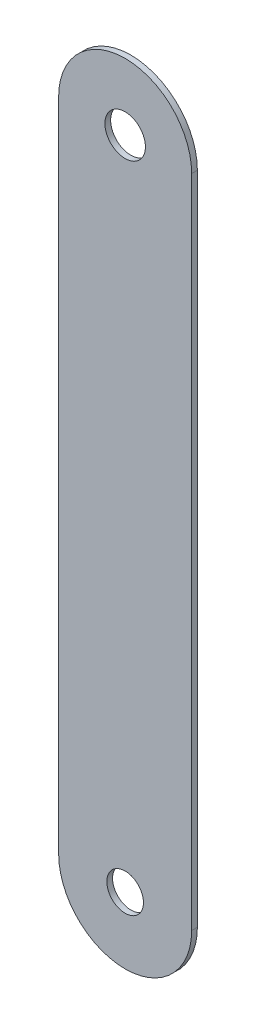
ISO-10303-21;
HEADER;
FILE_DESCRIPTION(('STEP AP214'),'2;1');
FILE_NAME('part.step','',(''),(''),'','','');
FILE_SCHEMA(('AUTOMOTIVE_DESIGN { 1 0 10303 214 1 1 1 1 }'));
ENDSEC;
DATA;
#1=APPLICATION_CONTEXT('core data for automotive mechanical design processes');
#2=APPLICATION_PROTOCOL_DEFINITION('international standard','automotive_design',2000,#1);
#3=PRODUCT_CONTEXT('',#1,'mechanical');
#4=PRODUCT('Part','Part','',(#3));
#5=PRODUCT_RELATED_PRODUCT_CATEGORY('part','',(#4));
#6=PRODUCT_DEFINITION_FORMATION('','',#4);
#7=PRODUCT_DEFINITION_CONTEXT('part definition',#1,'design');
#8=PRODUCT_DEFINITION('design','',#6,#7);
#9=PRODUCT_DEFINITION_SHAPE('','',#8);
#10=(LENGTH_UNIT() NAMED_UNIT(*) SI_UNIT(.MILLI.,.METRE.));
#11=(NAMED_UNIT(*) PLANE_ANGLE_UNIT() SI_UNIT($,.RADIAN.));
#12=(NAMED_UNIT(*) SI_UNIT($,.STERADIAN.) SOLID_ANGLE_UNIT());
#13=UNCERTAINTY_MEASURE_WITH_UNIT(LENGTH_MEASURE(1.E-05),#10,'distance_accuracy_value','');
#14=(GEOMETRIC_REPRESENTATION_CONTEXT(3) GLOBAL_UNCERTAINTY_ASSIGNED_CONTEXT((#13)) GLOBAL_UNIT_ASSIGNED_CONTEXT((#10,
#11,#12)) REPRESENTATION_CONTEXT('',''));
#15=CARTESIAN_POINT('',(0.,0.,0.));
#16=DIRECTION('',(0.,0.,1.));
#17=DIRECTION('',(1.,0.,0.));
#18=AXIS2_PLACEMENT_3D('',#15,#16,#17);
#19=CARTESIAN_POINT('',(0.,42.1270662841314,-0.7366));
#20=DIRECTION('',(0.,0.,1.));
#21=DIRECTION('',(1.,0.,0.));
#22=AXIS2_PLACEMENT_3D('',#19,#20,#21);
#23=CYLINDRICAL_SURFACE('',#22,8.57453561535418);
#24=CARTESIAN_POINT('',(0.,42.1270662841314,0.));
#25=DIRECTION('',(0.,0.,1.));
#26=DIRECTION('',(1.,0.,0.));
#27=AXIS2_PLACEMENT_3D('',#24,#25,#26);
#28=CIRCLE('',#27,8.57453561535418);
#29=CARTESIAN_POINT('',(8.57453561535418,42.1270662841314,0.));
#30=VERTEX_POINT('',#29);
#31=CARTESIAN_POINT('',(-8.57453561535418,42.1270662841314,0.));
#32=VERTEX_POINT('',#31);
#33=EDGE_CURVE('E100',#30,#32,#28,.T.);
#34=ORIENTED_EDGE('',*,*,#33,.F.);
#35=DIRECTION('',(0.,0.,1.));
#36=VECTOR('',#35,1.);
#37=CARTESIAN_POINT('',(8.57453561535418,42.1270662841314,-0.7366));
#38=LINE('',#37,#36);
#39=CARTESIAN_POINT('',(8.57453561535418,42.1270662841314,-0.7366));
#40=VERTEX_POINT('',#39);
#41=EDGE_CURVE('E11',#40,#30,#38,.T.);
#42=ORIENTED_EDGE('',*,*,#41,.F.);
#43=CARTESIAN_POINT('',(0.,42.1270662841314,-0.7366));
#44=DIRECTION('',(0.,0.,1.));
#45=DIRECTION('',(1.,0.,0.));
#46=AXIS2_PLACEMENT_3D('',#43,#44,#45);
#47=CIRCLE('',#46,8.57453561535418);
#48=CARTESIAN_POINT('',(-8.57453561535418,42.1270662841314,-0.7366));
#49=VERTEX_POINT('',#48);
#50=EDGE_CURVE('E93',#40,#49,#47,.T.);
#51=ORIENTED_EDGE('',*,*,#50,.T.);
#52=DIRECTION('',(0.,0.,1.));
#53=VECTOR('',#52,1.);
#54=CARTESIAN_POINT('',(-8.57453561535418,42.1270662841314,-0.7366));
#55=LINE('',#54,#53);
#56=EDGE_CURVE('E38',#49,#32,#55,.T.);
#57=ORIENTED_EDGE('',*,*,#56,.T.);
#58=EDGE_LOOP('',(#34,#42,#51,#57));
#59=FACE_BOUND('',#58,.T.);
#60=ADVANCED_FACE('F35',(#59),#23,.T.);
#61=CARTESIAN_POINT('',(8.57453561535418,42.1270662841314,-0.7366));
#62=DIRECTION('',(1.,0.,0.));
#63=DIRECTION('',(0.,0.,-1.));
#64=AXIS2_PLACEMENT_3D('',#61,#62,#63);
#65=PLANE('',#64);
#66=DIRECTION('',(0.,1.,0.));
#67=VECTOR('',#66,1.);
#68=CARTESIAN_POINT('',(8.57453561535418,42.1270662841314,0.));
#69=LINE('',#68,#67);
#70=CARTESIAN_POINT('',(8.57453561535418,-42.3756035483446,0.));
#71=VERTEX_POINT('',#70);
#72=EDGE_CURVE('E95',#71,#30,#69,.T.);
#73=ORIENTED_EDGE('',*,*,#72,.F.);
#74=DIRECTION('',(0.,0.,1.));
#75=VECTOR('',#74,1.);
#76=CARTESIAN_POINT('',(8.57453561535418,-42.3756035483446,-0.7366));
#77=LINE('',#76,#75);
#78=CARTESIAN_POINT('',(8.57453561535418,-42.3756035483446,-0.7366));
#79=VERTEX_POINT('',#78);
#80=EDGE_CURVE('E44',#79,#71,#77,.T.);
#81=ORIENTED_EDGE('',*,*,#80,.F.);
#82=DIRECTION('',(0.,1.,0.));
#83=VECTOR('',#82,1.);
#84=CARTESIAN_POINT('',(8.57453561535418,42.1270662841314,-0.7366));
#85=LINE('',#84,#83);
#86=EDGE_CURVE('E90',#79,#40,#85,.T.);
#87=ORIENTED_EDGE('',*,*,#86,.T.);
#88=ORIENTED_EDGE('',*,*,#41,.T.);
#89=EDGE_LOOP('',(#73,#81,#87,#88));
#90=FACE_BOUND('',#89,.T.);
#91=ADVANCED_FACE('F111',(#90),#65,.T.);
#92=CARTESIAN_POINT('',(0.,-42.3756035483446,-0.7366));
#93=DIRECTION('',(0.,0.,1.));
#94=DIRECTION('',(1.,0.,0.));
#95=AXIS2_PLACEMENT_3D('',#92,#93,#94);
#96=CYLINDRICAL_SURFACE('',#95,8.57453561535418);
#97=CARTESIAN_POINT('',(0.,-42.3756035483446,0.));
#98=DIRECTION('',(0.,0.,1.));
#99=DIRECTION('',(1.,0.,0.));
#100=AXIS2_PLACEMENT_3D('',#97,#98,#99);
#101=CIRCLE('',#100,8.57453561535418);
#102=CARTESIAN_POINT('',(-8.57453561535418,-42.3756035483446,0.));
#103=VERTEX_POINT('',#102);
#104=EDGE_CURVE('E85',#103,#71,#101,.T.);
#105=ORIENTED_EDGE('',*,*,#104,.F.);
#106=DIRECTION('',(0.,0.,1.));
#107=VECTOR('',#106,1.);
#108=CARTESIAN_POINT('',(-8.57453561535418,-42.3756035483446,-0.7366));
#109=LINE('',#108,#107);
#110=CARTESIAN_POINT('',(-8.57453561535418,-42.3756035483446,-0.7366));
#111=VERTEX_POINT('',#110);
#112=EDGE_CURVE('E80',#111,#103,#109,.T.);
#113=ORIENTED_EDGE('',*,*,#112,.F.);
#114=CARTESIAN_POINT('',(0.,-42.3756035483446,-0.7366));
#115=DIRECTION('',(0.,0.,1.));
#116=DIRECTION('',(1.,0.,0.));
#117=AXIS2_PLACEMENT_3D('',#114,#115,#116);
#118=CIRCLE('',#117,8.57453561535418);
#119=EDGE_CURVE('E83',#111,#79,#118,.T.);
#120=ORIENTED_EDGE('',*,*,#119,.T.);
#121=ORIENTED_EDGE('',*,*,#80,.T.);
#122=EDGE_LOOP('',(#105,#113,#120,#121));
#123=FACE_BOUND('',#122,.T.);
#124=ADVANCED_FACE('F82',(#123),#96,.T.);
#125=CARTESIAN_POINT('',(-8.57453561535418,42.1270662841314,-0.7366));
#126=DIRECTION('',(-1.,0.,0.));
#127=DIRECTION('',(0.,0.,1.));
#128=AXIS2_PLACEMENT_3D('',#125,#126,#127);
#129=PLANE('',#128);
#130=DIRECTION('',(0.,-1.,0.));
#131=VECTOR('',#130,1.);
#132=CARTESIAN_POINT('',(-8.57453561535418,42.1270662841314,0.));
#133=LINE('',#132,#131);
#134=EDGE_CURVE('E103',#32,#103,#133,.T.);
#135=ORIENTED_EDGE('',*,*,#134,.F.);
#136=ORIENTED_EDGE('',*,*,#56,.F.);
#137=DIRECTION('',(0.,-1.,0.));
#138=VECTOR('',#137,1.);
#139=CARTESIAN_POINT('',(-8.57453561535418,42.1270662841314,-0.7366));
#140=LINE('',#139,#138);
#141=EDGE_CURVE('E89',#49,#111,#140,.T.);
#142=ORIENTED_EDGE('',*,*,#141,.T.);
#143=ORIENTED_EDGE('',*,*,#112,.T.);
#144=EDGE_LOOP('',(#135,#136,#142,#143));
#145=FACE_BOUND('',#144,.T.);
#146=ADVANCED_FACE('F92',(#145),#129,.T.);
#147=CARTESIAN_POINT('',(0.,42.1270662841314,-0.7366));
#148=DIRECTION('',(0.,0.,1.));
#149=DIRECTION('',(1.,0.,0.));
#150=AXIS2_PLACEMENT_3D('',#147,#148,#149);
#151=PLANE('',#150);
#152=CARTESIAN_POINT('',(0.,-42.3756035483446,-0.7366));
#153=DIRECTION('',(0.,0.,1.));
#154=DIRECTION('',(1.,0.,0.));
#155=AXIS2_PLACEMENT_3D('',#152,#153,#154);
#156=CIRCLE('',#155,2.36110401002507);
#157=CARTESIAN_POINT('',(2.36110401002507,-42.3756035483446,-0.7366));
#158=VERTEX_POINT('',#157);
#159=EDGE_CURVE('E144',#158,#158,#156,.T.);
#160=ORIENTED_EDGE('',*,*,#159,.T.);
#161=EDGE_LOOP('',(#160));
#162=FACE_BOUND('',#161,.T.);
#163=CARTESIAN_POINT('',(0.,42.1270662841314,-0.7366));
#164=DIRECTION('',(0.,0.,1.));
#165=DIRECTION('',(1.,0.,0.));
#166=AXIS2_PLACEMENT_3D('',#163,#164,#165);
#167=CIRCLE('',#166,2.60964127423824);
#168=CARTESIAN_POINT('',(2.60964127423824,42.1270662841314,-0.7366));
#169=VERTEX_POINT('',#168);
#170=EDGE_CURVE('E104',#169,#169,#167,.T.);
#171=ORIENTED_EDGE('',*,*,#170,.T.);
#172=EDGE_LOOP('',(#171));
#173=FACE_BOUND('',#172,.T.);
#174=ORIENTED_EDGE('',*,*,#50,.F.);
#175=ORIENTED_EDGE('',*,*,#86,.F.);
#176=ORIENTED_EDGE('',*,*,#119,.F.);
#177=ORIENTED_EDGE('',*,*,#141,.F.);
#178=EDGE_LOOP('',(#174,#175,#176,#177));
#179=FACE_BOUND('',#178,.T.);
#180=ADVANCED_FACE('F88',(#162,#173,#179),#151,.F.);
#181=CARTESIAN_POINT('',(0.,42.1270662841314,0.));
#182=DIRECTION('',(0.,0.,1.));
#183=DIRECTION('',(1.,0.,0.));
#184=AXIS2_PLACEMENT_3D('',#181,#182,#183);
#185=PLANE('',#184);
#186=CARTESIAN_POINT('',(0.,-42.3756035483446,0.));
#187=DIRECTION('',(0.,0.,1.));
#188=DIRECTION('',(1.,0.,0.));
#189=AXIS2_PLACEMENT_3D('',#186,#187,#188);
#190=CIRCLE('',#189,2.36110401002507);
#191=CARTESIAN_POINT('',(2.36110401002507,-42.3756035483446,0.));
#192=VERTEX_POINT('',#191);
#193=EDGE_CURVE('E147',#192,#192,#190,.T.);
#194=ORIENTED_EDGE('',*,*,#193,.F.);
#195=EDGE_LOOP('',(#194));
#196=FACE_BOUND('',#195,.T.);
#197=CARTESIAN_POINT('',(0.,42.1270662841314,0.));
#198=DIRECTION('',(0.,0.,1.));
#199=DIRECTION('',(1.,0.,0.));
#200=AXIS2_PLACEMENT_3D('',#197,#198,#199);
#201=CIRCLE('',#200,2.60964127423824);
#202=CARTESIAN_POINT('',(2.60964127423824,42.1270662841314,0.));
#203=VERTEX_POINT('',#202);
#204=EDGE_CURVE('E149',#203,#203,#201,.T.);
#205=ORIENTED_EDGE('',*,*,#204,.F.);
#206=EDGE_LOOP('',(#205));
#207=FACE_BOUND('',#206,.T.);
#208=ORIENTED_EDGE('',*,*,#33,.T.);
#209=ORIENTED_EDGE('',*,*,#134,.T.);
#210=ORIENTED_EDGE('',*,*,#104,.T.);
#211=ORIENTED_EDGE('',*,*,#72,.T.);
#212=EDGE_LOOP('',(#208,#209,#210,#211));
#213=FACE_BOUND('',#212,.T.);
#214=ADVANCED_FACE('F110',(#196,#207,#213),#185,.T.);
#215=CARTESIAN_POINT('',(0.,42.1270662841314,-0.7366));
#216=DIRECTION('',(0.,0.,1.));
#217=DIRECTION('',(1.,0.,0.));
#218=AXIS2_PLACEMENT_3D('',#215,#216,#217);
#219=CYLINDRICAL_SURFACE('',#218,2.60964127423824);
#220=ORIENTED_EDGE('',*,*,#170,.F.);
#221=EDGE_LOOP('',(#220));
#222=FACE_BOUND('',#221,.T.);
#223=ORIENTED_EDGE('',*,*,#204,.T.);
#224=EDGE_LOOP('',(#223));
#225=FACE_BOUND('',#224,.T.);
#226=ADVANCED_FACE('F129',(#222,#225),#219,.F.);
#227=CARTESIAN_POINT('',(0.,-42.3756035483446,-0.7366));
#228=DIRECTION('',(0.,0.,1.));
#229=DIRECTION('',(1.,0.,0.));
#230=AXIS2_PLACEMENT_3D('',#227,#228,#229);
#231=CYLINDRICAL_SURFACE('',#230,2.36110401002507);
#232=ORIENTED_EDGE('',*,*,#159,.F.);
#233=EDGE_LOOP('',(#232));
#234=FACE_BOUND('',#233,.T.);
#235=ORIENTED_EDGE('',*,*,#193,.T.);
#236=EDGE_LOOP('',(#235));
#237=FACE_BOUND('',#236,.T.);
#238=ADVANCED_FACE('F136',(#234,#237),#231,.F.);
#239=CLOSED_SHELL('',(#60,#91,#124,#146,#180,#214,#226,#238));
#240=MANIFOLD_SOLID_BREP('B2',#239);
#241=ADVANCED_BREP_SHAPE_REPRESENTATION('',(#18,#240),#14);
#242=SHAPE_DEFINITION_REPRESENTATION(#9,#241);
ENDSEC;
END-ISO-10303-21;
